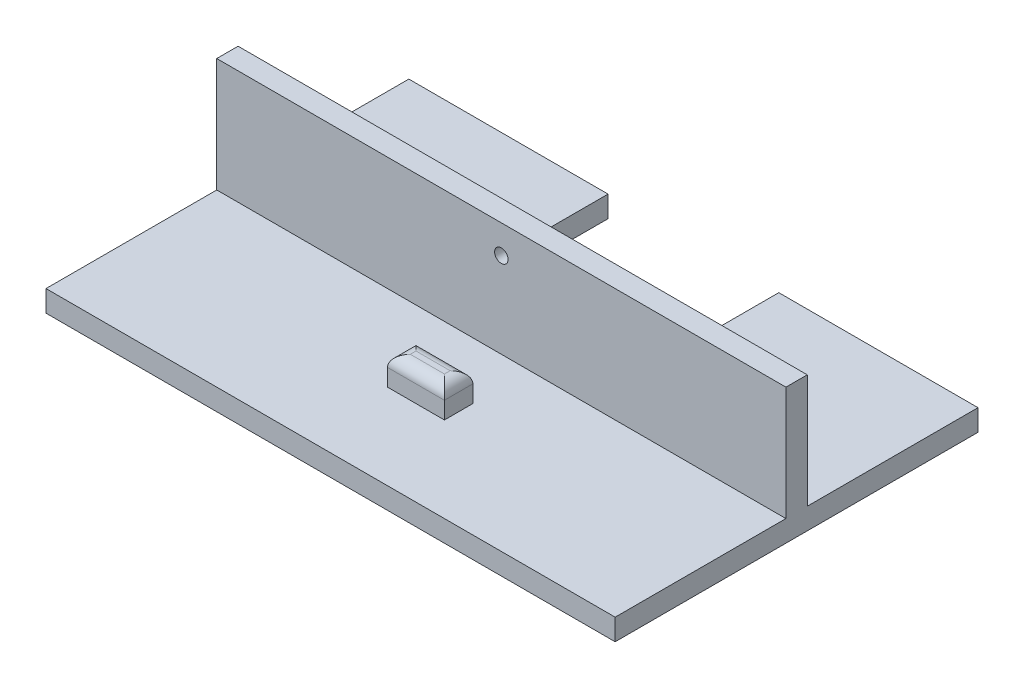
ISO-10303-21;
HEADER;
FILE_DESCRIPTION(('STEP AP214'),'2;1');
FILE_NAME('part.step','',(''),(''),'','','');
FILE_SCHEMA(('AUTOMOTIVE_DESIGN { 1 0 10303 214 1 1 1 1 }'));
ENDSEC;
DATA;
#1=APPLICATION_CONTEXT('core data for automotive mechanical design processes');
#2=APPLICATION_PROTOCOL_DEFINITION('international standard','automotive_design',2000,#1);
#3=PRODUCT_CONTEXT('',#1,'mechanical');
#4=PRODUCT('Part','Part','',(#3));
#5=PRODUCT_RELATED_PRODUCT_CATEGORY('part','',(#4));
#6=PRODUCT_DEFINITION_FORMATION('','',#4);
#7=PRODUCT_DEFINITION_CONTEXT('part definition',#1,'design');
#8=PRODUCT_DEFINITION('design','',#6,#7);
#9=PRODUCT_DEFINITION_SHAPE('','',#8);
#10=(LENGTH_UNIT() NAMED_UNIT(*) SI_UNIT(.MILLI.,.METRE.));
#11=(NAMED_UNIT(*) PLANE_ANGLE_UNIT() SI_UNIT($,.RADIAN.));
#12=(NAMED_UNIT(*) SI_UNIT($,.STERADIAN.) SOLID_ANGLE_UNIT());
#13=UNCERTAINTY_MEASURE_WITH_UNIT(LENGTH_MEASURE(1.E-05),#10,'distance_accuracy_value','');
#14=(GEOMETRIC_REPRESENTATION_CONTEXT(3) GLOBAL_UNCERTAINTY_ASSIGNED_CONTEXT((#13)) GLOBAL_UNIT_ASSIGNED_CONTEXT((#10,
#11,#12)) REPRESENTATION_CONTEXT('',''));
#15=CARTESIAN_POINT('',(0.,0.,0.));
#16=DIRECTION('',(0.,0.,1.));
#17=DIRECTION('',(1.,0.,0.));
#18=AXIS2_PLACEMENT_3D('',#15,#16,#17);
#19=CARTESIAN_POINT('',(127.,0.,-38.1));
#20=DIRECTION('',(0.,0.,1.));
#21=DIRECTION('',(1.,0.,0.));
#22=AXIS2_PLACEMENT_3D('',#19,#20,#21);
#23=PLANE('',#22);
#24=DIRECTION('',(-1.,0.,0.));
#25=VECTOR('',#24,1.);
#26=CARTESIAN_POINT('',(127.,4.7625,-38.1));
#27=LINE('',#26,#25);
#28=CARTESIAN_POINT('',(44.45,4.7625,-38.1));
#29=VERTEX_POINT('',#28);
#30=CARTESIAN_POINT('',(0.,4.7625,-38.1));
#31=VERTEX_POINT('',#30);
#32=EDGE_CURVE('E313',#29,#31,#27,.T.);
#33=ORIENTED_EDGE('',*,*,#32,.F.);
#34=DIRECTION('',(0.,1.,0.));
#35=VECTOR('',#34,1.);
#36=CARTESIAN_POINT('',(44.45,0.,-38.1));
#37=LINE('',#36,#35);
#38=CARTESIAN_POINT('',(44.45,0.,-38.1));
#39=VERTEX_POINT('',#38);
#40=EDGE_CURVE('E200',#39,#29,#37,.T.);
#41=ORIENTED_EDGE('',*,*,#40,.F.);
#42=DIRECTION('',(-1.,0.,0.));
#43=VECTOR('',#42,1.);
#44=CARTESIAN_POINT('',(127.,0.,-38.1));
#45=LINE('',#44,#43);
#46=CARTESIAN_POINT('',(0.,0.,-38.1));
#47=VERTEX_POINT('',#46);
#48=EDGE_CURVE('E189',#39,#47,#45,.T.);
#49=ORIENTED_EDGE('',*,*,#48,.T.);
#50=DIRECTION('',(0.,1.,0.));
#51=VECTOR('',#50,1.);
#52=CARTESIAN_POINT('',(0.,0.,-38.1));
#53=LINE('',#52,#51);
#54=EDGE_CURVE('E303',#47,#31,#53,.T.);
#55=ORIENTED_EDGE('',*,*,#54,.T.);
#56=EDGE_LOOP('',(#33,#41,#49,#55));
#57=FACE_BOUND('',#56,.T.);
#58=ADVANCED_FACE('F40',(#57),#23,.F.);
#59=CARTESIAN_POINT('',(127.,4.7625,0.));
#60=DIRECTION('',(0.,1.,0.));
#61=DIRECTION('',(0.,0.,1.));
#62=AXIS2_PLACEMENT_3D('',#59,#60,#61);
#63=PLANE('',#62);
#64=DIRECTION('',(0.,0.,1.));
#65=VECTOR('',#64,1.);
#66=CARTESIAN_POINT('',(44.45,4.7625,-38.1));
#67=LINE('',#66,#65);
#68=CARTESIAN_POINT('',(44.45,4.7625,0.));
#69=VERTEX_POINT('',#68);
#70=EDGE_CURVE('E58',#29,#69,#67,.T.);
#71=ORIENTED_EDGE('',*,*,#70,.F.);
#72=ORIENTED_EDGE('',*,*,#32,.T.);
#73=DIRECTION('',(0.,0.,-1.));
#74=VECTOR('',#73,1.);
#75=CARTESIAN_POINT('',(0.,4.7625,0.));
#76=LINE('',#75,#74);
#77=CARTESIAN_POINT('',(0.,4.7625,0.));
#78=VERTEX_POINT('',#77);
#79=EDGE_CURVE('E252',#78,#31,#76,.T.);
#80=ORIENTED_EDGE('',*,*,#79,.F.);
#81=DIRECTION('',(-1.,0.,0.));
#82=VECTOR('',#81,1.);
#83=CARTESIAN_POINT('',(127.,4.7625,0.));
#84=LINE('',#83,#82);
#85=EDGE_CURVE('E279',#69,#78,#84,.T.);
#86=ORIENTED_EDGE('',*,*,#85,.F.);
#87=EDGE_LOOP('',(#71,#72,#80,#86));
#88=FACE_BOUND('',#87,.T.);
#89=ADVANCED_FACE('F408',(#88),#63,.T.);
#90=CARTESIAN_POINT('',(127.,4.7625,0.));
#91=DIRECTION('',(0.,1.,0.));
#92=DIRECTION('',(0.,0.,1.));
#93=AXIS2_PLACEMENT_3D('',#90,#91,#92);
#94=PLANE('',#93);
#95=DIRECTION('',(0.,0.,-1.));
#96=VECTOR('',#95,1.);
#97=CARTESIAN_POINT('',(0.,4.7625,0.));
#98=LINE('',#97,#96);
#99=CARTESIAN_POINT('',(0.,4.7625,42.8625));
#100=VERTEX_POINT('',#99);
#101=CARTESIAN_POINT('',(0.,4.7625,4.7625));
#102=VERTEX_POINT('',#101);
#103=EDGE_CURVE('E291',#100,#102,#98,.T.);
#104=ORIENTED_EDGE('',*,*,#103,.F.);
#105=DIRECTION('',(-1.,0.,0.));
#106=VECTOR('',#105,1.);
#107=CARTESIAN_POINT('',(127.,4.7625,42.8625));
#108=LINE('',#107,#106);
#109=CARTESIAN_POINT('',(127.,4.7625,42.8625));
#110=VERTEX_POINT('',#109);
#111=EDGE_CURVE('E325',#110,#100,#108,.T.);
#112=ORIENTED_EDGE('',*,*,#111,.F.);
#113=DIRECTION('',(0.,0.,-1.));
#114=VECTOR('',#113,1.);
#115=CARTESIAN_POINT('',(127.,4.7625,0.));
#116=LINE('',#115,#114);
#117=CARTESIAN_POINT('',(127.,4.7625,4.7625));
#118=VERTEX_POINT('',#117);
#119=EDGE_CURVE('E260',#110,#118,#116,.T.);
#120=ORIENTED_EDGE('',*,*,#119,.T.);
#121=DIRECTION('',(-1.,0.,0.));
#122=VECTOR('',#121,1.);
#123=CARTESIAN_POINT('',(127.,4.7625,4.7625));
#124=LINE('',#123,#122);
#125=EDGE_CURVE('E328',#118,#102,#124,.T.);
#126=ORIENTED_EDGE('',*,*,#125,.T.);
#127=EDGE_LOOP('',(#104,#112,#120,#126));
#128=FACE_BOUND('',#127,.T.);
#129=DIRECTION('',(1.,0.,0.));
#130=VECTOR('',#129,1.);
#131=CARTESIAN_POINT('',(57.15,4.7625,23.8125));
#132=LINE('',#131,#130);
#133=CARTESIAN_POINT('',(57.15,4.7625,23.8125));
#134=VERTEX_POINT('',#133);
#135=CARTESIAN_POINT('',(69.85,4.7625,23.8125));
#136=VERTEX_POINT('',#135);
#137=EDGE_CURVE('E222',#134,#136,#132,.T.);
#138=ORIENTED_EDGE('',*,*,#137,.F.);
#139=DIRECTION('',(0.,0.,1.));
#140=VECTOR('',#139,1.);
#141=CARTESIAN_POINT('',(57.15,4.7625,23.8125));
#142=LINE('',#141,#140);
#143=CARTESIAN_POINT('',(57.15,4.7625,17.4625));
#144=VERTEX_POINT('',#143);
#145=EDGE_CURVE('E218',#144,#134,#142,.T.);
#146=ORIENTED_EDGE('',*,*,#145,.F.);
#147=DIRECTION('',(-1.,0.,0.));
#148=VECTOR('',#147,1.);
#149=CARTESIAN_POINT('',(57.15,4.7625,17.4625));
#150=LINE('',#149,#148);
#151=CARTESIAN_POINT('',(69.85,4.7625,17.4625));
#152=VERTEX_POINT('',#151);
#153=EDGE_CURVE('E230',#152,#144,#150,.T.);
#154=ORIENTED_EDGE('',*,*,#153,.F.);
#155=DIRECTION('',(0.,0.,-1.));
#156=VECTOR('',#155,1.);
#157=CARTESIAN_POINT('',(69.85,4.7625,23.8125));
#158=LINE('',#157,#156);
#159=EDGE_CURVE('E226',#136,#152,#158,.T.);
#160=ORIENTED_EDGE('',*,*,#159,.F.);
#161=EDGE_LOOP('',(#138,#146,#154,#160));
#162=FACE_BOUND('',#161,.T.);
#163=ADVANCED_FACE('F416',(#128,#162),#94,.T.);
#164=CARTESIAN_POINT('',(127.,0.,0.));
#165=DIRECTION('',(0.,0.,-1.));
#166=DIRECTION('',(0.,1.,0.));
#167=AXIS2_PLACEMENT_3D('',#164,#165,#166);
#168=PLANE('',#167);
#169=CARTESIAN_POINT('',(63.5,23.8125,0.));
#170=DIRECTION('',(0.,0.,-1.));
#171=DIRECTION('',(0.,1.,0.));
#172=AXIS2_PLACEMENT_3D('',#169,#170,#171);
#173=CIRCLE('',#172,1.49999700000001);
#174=CARTESIAN_POINT('',(63.5,25.312497,0.));
#175=VERTEX_POINT('',#174);
#176=EDGE_CURVE('E214',#175,#175,#173,.T.);
#177=ORIENTED_EDGE('',*,*,#176,.F.);
#178=EDGE_LOOP('',(#177));
#179=FACE_BOUND('',#178,.T.);
#180=DIRECTION('',(0.,-1.,0.));
#181=VECTOR('',#180,1.);
#182=CARTESIAN_POINT('',(0.,0.,0.));
#183=LINE('',#182,#181);
#184=CARTESIAN_POINT('',(0.,30.1625,0.));
#185=VERTEX_POINT('',#184);
#186=EDGE_CURVE('E246',#185,#78,#183,.T.);
#187=ORIENTED_EDGE('',*,*,#186,.F.);
#188=DIRECTION('',(-1.,0.,0.));
#189=VECTOR('',#188,1.);
#190=CARTESIAN_POINT('',(127.,30.1625,0.));
#191=LINE('',#190,#189);
#192=CARTESIAN_POINT('',(127.,30.1625,0.));
#193=VERTEX_POINT('',#192);
#194=EDGE_CURVE('E334',#193,#185,#191,.T.);
#195=ORIENTED_EDGE('',*,*,#194,.F.);
#196=DIRECTION('',(0.,-1.,0.));
#197=VECTOR('',#196,1.);
#198=CARTESIAN_POINT('',(127.,0.,0.));
#199=LINE('',#198,#197);
#200=CARTESIAN_POINT('',(127.,4.7625,0.));
#201=VERTEX_POINT('',#200);
#202=EDGE_CURVE('E247',#193,#201,#199,.T.);
#203=ORIENTED_EDGE('',*,*,#202,.T.);
#204=CARTESIAN_POINT('',(82.55,4.7625,0.));
#205=VERTEX_POINT('',#204);
#206=EDGE_CURVE('E310',#201,#205,#84,.T.);
#207=ORIENTED_EDGE('',*,*,#206,.T.);
#208=DIRECTION('',(0.,1.,0.));
#209=VECTOR('',#208,1.);
#210=CARTESIAN_POINT('',(82.55,0.,0.));
#211=LINE('',#210,#209);
#212=CARTESIAN_POINT('',(82.55,0.,0.));
#213=VERTEX_POINT('',#212);
#214=EDGE_CURVE('E173',#213,#205,#211,.T.);
#215=ORIENTED_EDGE('',*,*,#214,.F.);
#216=DIRECTION('',(1.,0.,0.));
#217=VECTOR('',#216,1.);
#218=CARTESIAN_POINT('',(44.45,0.,0.));
#219=LINE('',#218,#217);
#220=CARTESIAN_POINT('',(44.45,0.,0.));
#221=VERTEX_POINT('',#220);
#222=EDGE_CURVE('E177',#221,#213,#219,.T.);
#223=ORIENTED_EDGE('',*,*,#222,.F.);
#224=DIRECTION('',(0.,1.,0.));
#225=VECTOR('',#224,1.);
#226=CARTESIAN_POINT('',(44.45,0.,0.));
#227=LINE('',#226,#225);
#228=EDGE_CURVE('E164',#221,#69,#227,.T.);
#229=ORIENTED_EDGE('',*,*,#228,.T.);
#230=ORIENTED_EDGE('',*,*,#85,.T.);
#231=EDGE_LOOP('',(#187,#195,#203,#207,#215,#223,#229,#230));
#232=FACE_BOUND('',#231,.T.);
#233=ADVANCED_FACE('F179',(#179,#232),#168,.T.);
#234=CARTESIAN_POINT('',(127.,30.1625,0.));
#235=DIRECTION('',(0.,1.,0.));
#236=DIRECTION('',(0.,0.,1.));
#237=AXIS2_PLACEMENT_3D('',#234,#235,#236);
#238=PLANE('',#237);
#239=DIRECTION('',(0.,0.,-1.));
#240=VECTOR('',#239,1.);
#241=CARTESIAN_POINT('',(0.,30.1625,0.));
#242=LINE('',#241,#240);
#243=CARTESIAN_POINT('',(0.,30.1625,4.7625));
#244=VERTEX_POINT('',#243);
#245=EDGE_CURVE('E283',#244,#185,#242,.T.);
#246=ORIENTED_EDGE('',*,*,#245,.F.);
#247=DIRECTION('',(-1.,0.,0.));
#248=VECTOR('',#247,1.);
#249=CARTESIAN_POINT('',(127.,30.1625,4.7625));
#250=LINE('',#249,#248);
#251=CARTESIAN_POINT('',(127.,30.1625,4.7625));
#252=VERTEX_POINT('',#251);
#253=EDGE_CURVE('E331',#252,#244,#250,.T.);
#254=ORIENTED_EDGE('',*,*,#253,.F.);
#255=DIRECTION('',(0.,0.,-1.));
#256=VECTOR('',#255,1.);
#257=CARTESIAN_POINT('',(127.,30.1625,0.));
#258=LINE('',#257,#256);
#259=EDGE_CURVE('E251',#252,#193,#258,.T.);
#260=ORIENTED_EDGE('',*,*,#259,.T.);
#261=ORIENTED_EDGE('',*,*,#194,.T.);
#262=EDGE_LOOP('',(#246,#254,#260,#261));
#263=FACE_BOUND('',#262,.T.);
#264=ADVANCED_FACE('F457',(#263),#238,.T.);
#265=CARTESIAN_POINT('',(127.,0.,4.7625));
#266=DIRECTION('',(0.,0.,1.));
#267=DIRECTION('',(0.,-1.,0.));
#268=AXIS2_PLACEMENT_3D('',#265,#266,#267);
#269=PLANE('',#268);
#270=CARTESIAN_POINT('',(63.5,23.8125,4.7625));
#271=DIRECTION('',(0.,0.,1.));
#272=DIRECTION('',(1.,0.,0.));
#273=AXIS2_PLACEMENT_3D('',#270,#271,#272);
#274=CIRCLE('',#273,1.49999700000001);
#275=CARTESIAN_POINT('',(64.999997,23.8125,4.7625));
#276=VERTEX_POINT('',#275);
#277=EDGE_CURVE('E210',#276,#276,#274,.T.);
#278=ORIENTED_EDGE('',*,*,#277,.F.);
#279=EDGE_LOOP('',(#278));
#280=FACE_BOUND('',#279,.T.);
#281=DIRECTION('',(0.,1.,0.));
#282=VECTOR('',#281,1.);
#283=CARTESIAN_POINT('',(0.,0.,4.7625));
#284=LINE('',#283,#282);
#285=EDGE_CURVE('E287',#102,#244,#284,.T.);
#286=ORIENTED_EDGE('',*,*,#285,.F.);
#287=ORIENTED_EDGE('',*,*,#125,.F.);
#288=DIRECTION('',(0.,1.,0.));
#289=VECTOR('',#288,1.);
#290=CARTESIAN_POINT('',(127.,0.,4.7625));
#291=LINE('',#290,#289);
#292=EDGE_CURVE('E256',#118,#252,#291,.T.);
#293=ORIENTED_EDGE('',*,*,#292,.T.);
#294=ORIENTED_EDGE('',*,*,#253,.T.);
#295=EDGE_LOOP('',(#286,#287,#293,#294));
#296=FACE_BOUND('',#295,.T.);
#297=ADVANCED_FACE('F459',(#280,#296),#269,.T.);
#298=CARTESIAN_POINT('',(127.,0.,42.8625));
#299=DIRECTION('',(0.,0.,1.));
#300=DIRECTION('',(1.,0.,0.));
#301=AXIS2_PLACEMENT_3D('',#298,#299,#300);
#302=PLANE('',#301);
#303=DIRECTION('',(0.,1.,0.));
#304=VECTOR('',#303,1.);
#305=CARTESIAN_POINT('',(0.,0.,42.8625));
#306=LINE('',#305,#304);
#307=CARTESIAN_POINT('',(0.,0.,42.8625));
#308=VERTEX_POINT('',#307);
#309=EDGE_CURVE('E295',#308,#100,#306,.T.);
#310=ORIENTED_EDGE('',*,*,#309,.F.);
#311=DIRECTION('',(-1.,0.,0.));
#312=VECTOR('',#311,1.);
#313=CARTESIAN_POINT('',(127.,0.,42.8625));
#314=LINE('',#313,#312);
#315=CARTESIAN_POINT('',(127.,0.,42.8625));
#316=VERTEX_POINT('',#315);
#317=EDGE_CURVE('E322',#316,#308,#314,.T.);
#318=ORIENTED_EDGE('',*,*,#317,.F.);
#319=DIRECTION('',(0.,1.,0.));
#320=VECTOR('',#319,1.);
#321=CARTESIAN_POINT('',(127.,0.,42.8625));
#322=LINE('',#321,#320);
#323=EDGE_CURVE('E264',#316,#110,#322,.T.);
#324=ORIENTED_EDGE('',*,*,#323,.T.);
#325=ORIENTED_EDGE('',*,*,#111,.T.);
#326=EDGE_LOOP('',(#310,#318,#324,#325));
#327=FACE_BOUND('',#326,.T.);
#328=ADVANCED_FACE('F430',(#327),#302,.T.);
#329=CARTESIAN_POINT('',(127.,0.,0.));
#330=DIRECTION('',(0.,-1.,0.));
#331=DIRECTION('',(0.,0.,-1.));
#332=AXIS2_PLACEMENT_3D('',#329,#330,#331);
#333=PLANE('',#332);
#334=DIRECTION('',(0.,0.,1.));
#335=VECTOR('',#334,1.);
#336=CARTESIAN_POINT('',(44.45,0.,-38.1));
#337=LINE('',#336,#335);
#338=EDGE_CURVE('E168',#39,#221,#337,.T.);
#339=ORIENTED_EDGE('',*,*,#338,.T.);
#340=ORIENTED_EDGE('',*,*,#222,.T.);
#341=DIRECTION('',(0.,0.,-1.));
#342=VECTOR('',#341,1.);
#343=CARTESIAN_POINT('',(82.55,0.,-38.1));
#344=LINE('',#343,#342);
#345=CARTESIAN_POINT('',(82.55,0.,-38.1));
#346=VERTEX_POINT('',#345);
#347=EDGE_CURVE('E174',#213,#346,#344,.T.);
#348=ORIENTED_EDGE('',*,*,#347,.T.);
#349=CARTESIAN_POINT('',(127.,0.,-38.1));
#350=VERTEX_POINT('',#349);
#351=EDGE_CURVE('E318',#350,#346,#45,.T.);
#352=ORIENTED_EDGE('',*,*,#351,.F.);
#353=DIRECTION('',(0.,0.,1.));
#354=VECTOR('',#353,1.);
#355=CARTESIAN_POINT('',(127.,0.,0.));
#356=LINE('',#355,#354);
#357=EDGE_CURVE('E268',#350,#316,#356,.T.);
#358=ORIENTED_EDGE('',*,*,#357,.T.);
#359=ORIENTED_EDGE('',*,*,#317,.T.);
#360=DIRECTION('',(0.,0.,1.));
#361=VECTOR('',#360,1.);
#362=CARTESIAN_POINT('',(0.,0.,0.));
#363=LINE('',#362,#361);
#364=EDGE_CURVE('E299',#47,#308,#363,.T.);
#365=ORIENTED_EDGE('',*,*,#364,.F.);
#366=ORIENTED_EDGE('',*,*,#48,.F.);
#367=EDGE_LOOP('',(#339,#340,#348,#352,#358,#359,#365,#366));
#368=FACE_BOUND('',#367,.T.);
#369=ADVANCED_FACE('F187',(#368),#333,.T.);
#370=ORIENTED_EDGE('',*,*,#351,.T.);
#371=DIRECTION('',(0.,1.,0.));
#372=VECTOR('',#371,1.);
#373=CARTESIAN_POINT('',(82.55,0.,-38.1));
#374=LINE('',#373,#372);
#375=CARTESIAN_POINT('',(82.55,4.7625,-38.1));
#376=VERTEX_POINT('',#375);
#377=EDGE_CURVE('E204',#346,#376,#374,.T.);
#378=ORIENTED_EDGE('',*,*,#377,.T.);
#379=CARTESIAN_POINT('',(127.,4.7625,-38.1));
#380=VERTEX_POINT('',#379);
#381=EDGE_CURVE('E314',#380,#376,#27,.T.);
#382=ORIENTED_EDGE('',*,*,#381,.F.);
#383=DIRECTION('',(0.,1.,0.));
#384=VECTOR('',#383,1.);
#385=CARTESIAN_POINT('',(127.,0.,-38.1));
#386=LINE('',#385,#384);
#387=EDGE_CURVE('E272',#350,#380,#386,.T.);
#388=ORIENTED_EDGE('',*,*,#387,.F.);
#389=EDGE_LOOP('',(#370,#378,#382,#388));
#390=FACE_BOUND('',#389,.T.);
#391=ADVANCED_FACE('F411',(#390),#23,.F.);
#392=DIRECTION('',(0.,0.,-1.));
#393=VECTOR('',#392,1.);
#394=CARTESIAN_POINT('',(82.55,4.7625,-38.1));
#395=LINE('',#394,#393);
#396=EDGE_CURVE('E191',#205,#376,#395,.T.);
#397=ORIENTED_EDGE('',*,*,#396,.F.);
#398=ORIENTED_EDGE('',*,*,#206,.F.);
#399=DIRECTION('',(0.,0.,-1.));
#400=VECTOR('',#399,1.);
#401=CARTESIAN_POINT('',(127.,4.7625,0.));
#402=LINE('',#401,#400);
#403=EDGE_CURVE('E275',#201,#380,#402,.T.);
#404=ORIENTED_EDGE('',*,*,#403,.T.);
#405=ORIENTED_EDGE('',*,*,#381,.T.);
#406=EDGE_LOOP('',(#397,#398,#404,#405));
#407=FACE_BOUND('',#406,.T.);
#408=ADVANCED_FACE('F419',(#407),#63,.T.);
#409=CARTESIAN_POINT('',(127.,0.,0.));
#410=DIRECTION('',(1.,0.,0.));
#411=DIRECTION('',(0.,0.,-1.));
#412=AXIS2_PLACEMENT_3D('',#409,#410,#411);
#413=PLANE('',#412);
#414=ORIENTED_EDGE('',*,*,#202,.F.);
#415=ORIENTED_EDGE('',*,*,#259,.F.);
#416=ORIENTED_EDGE('',*,*,#292,.F.);
#417=ORIENTED_EDGE('',*,*,#119,.F.);
#418=ORIENTED_EDGE('',*,*,#323,.F.);
#419=ORIENTED_EDGE('',*,*,#357,.F.);
#420=ORIENTED_EDGE('',*,*,#387,.T.);
#421=ORIENTED_EDGE('',*,*,#403,.F.);
#422=EDGE_LOOP('',(#414,#415,#416,#417,#418,#419,#420,#421));
#423=FACE_BOUND('',#422,.T.);
#424=ADVANCED_FACE('F428',(#423),#413,.T.);
#425=CARTESIAN_POINT('',(0.,0.,0.));
#426=DIRECTION('',(1.,0.,0.));
#427=DIRECTION('',(0.,0.,-1.));
#428=AXIS2_PLACEMENT_3D('',#425,#426,#427);
#429=PLANE('',#428);
#430=ORIENTED_EDGE('',*,*,#186,.T.);
#431=ORIENTED_EDGE('',*,*,#79,.T.);
#432=ORIENTED_EDGE('',*,*,#54,.F.);
#433=ORIENTED_EDGE('',*,*,#364,.T.);
#434=ORIENTED_EDGE('',*,*,#309,.T.);
#435=ORIENTED_EDGE('',*,*,#103,.T.);
#436=ORIENTED_EDGE('',*,*,#285,.T.);
#437=ORIENTED_EDGE('',*,*,#245,.T.);
#438=EDGE_LOOP('',(#430,#431,#432,#433,#434,#435,#436,#437));
#439=FACE_BOUND('',#438,.T.);
#440=ADVANCED_FACE('F449',(#439),#429,.F.);
#441=CARTESIAN_POINT('',(57.15,11.1125,23.8125));
#442=DIRECTION('',(1.,0.,0.));
#443=DIRECTION('',(0.,0.,-1.));
#444=AXIS2_PLACEMENT_3D('',#441,#442,#443);
#445=PLANE('',#444);
#446=DIRECTION('',(0.,-1.,0.));
#447=VECTOR('',#446,1.);
#448=CARTESIAN_POINT('',(57.15,11.1125,23.8125));
#449=LINE('',#448,#447);
#450=CARTESIAN_POINT('',(57.15,8.5725,23.8125));
#451=VERTEX_POINT('',#450);
#452=EDGE_CURVE('E243',#451,#134,#449,.T.);
#453=ORIENTED_EDGE('',*,*,#452,.F.);
#454=DIRECTION('',(0.,0.,1.));
#455=VECTOR('',#454,1.);
#456=CARTESIAN_POINT('',(57.15,8.5725,23.8125));
#457=LINE('',#456,#455);
#458=CARTESIAN_POINT('',(57.15,8.5725,17.4625));
#459=VERTEX_POINT('',#458);
#460=EDGE_CURVE('E11',#451,#459,#457,.F.);
#461=ORIENTED_EDGE('',*,*,#460,.T.);
#462=DIRECTION('',(0.,-1.,0.));
#463=VECTOR('',#462,1.);
#464=CARTESIAN_POINT('',(57.15,11.1125,17.4625));
#465=LINE('',#464,#463);
#466=EDGE_CURVE('E234',#459,#144,#465,.T.);
#467=ORIENTED_EDGE('',*,*,#466,.T.);
#468=ORIENTED_EDGE('',*,*,#145,.T.);
#469=EDGE_LOOP('',(#453,#461,#467,#468));
#470=FACE_BOUND('',#469,.T.);
#471=ADVANCED_FACE('F384',(#470),#445,.F.);
#472=CARTESIAN_POINT('',(57.15,11.1125,23.8125));
#473=DIRECTION('',(0.,0.,-1.));
#474=DIRECTION('',(0.,1.,0.));
#475=AXIS2_PLACEMENT_3D('',#472,#473,#474);
#476=PLANE('',#475);
#477=DIRECTION('',(0.,-1.,0.));
#478=VECTOR('',#477,1.);
#479=CARTESIAN_POINT('',(69.85,11.1125,23.8125));
#480=LINE('',#479,#478);
#481=CARTESIAN_POINT('',(69.85,8.5725,23.8125));
#482=VERTEX_POINT('',#481);
#483=EDGE_CURVE('E240',#482,#136,#480,.T.);
#484=ORIENTED_EDGE('',*,*,#483,.F.);
#485=DIRECTION('',(1.,0.,0.));
#486=VECTOR('',#485,1.);
#487=CARTESIAN_POINT('',(57.15,8.5725,23.8125));
#488=LINE('',#487,#486);
#489=EDGE_CURVE('E50',#482,#451,#488,.F.);
#490=ORIENTED_EDGE('',*,*,#489,.T.);
#491=ORIENTED_EDGE('',*,*,#452,.T.);
#492=ORIENTED_EDGE('',*,*,#137,.T.);
#493=EDGE_LOOP('',(#484,#490,#491,#492));
#494=FACE_BOUND('',#493,.T.);
#495=ADVANCED_FACE('F466',(#494),#476,.F.);
#496=CARTESIAN_POINT('',(69.85,11.1125,23.8125));
#497=DIRECTION('',(-1.,0.,0.));
#498=DIRECTION('',(0.,0.,1.));
#499=AXIS2_PLACEMENT_3D('',#496,#497,#498);
#500=PLANE('',#499);
#501=DIRECTION('',(0.,-1.,0.));
#502=VECTOR('',#501,1.);
#503=CARTESIAN_POINT('',(69.85,11.1125,17.4625));
#504=LINE('',#503,#502);
#505=CARTESIAN_POINT('',(69.85,8.5725,17.4625));
#506=VERTEX_POINT('',#505);
#507=EDGE_CURVE('E237',#506,#152,#504,.T.);
#508=ORIENTED_EDGE('',*,*,#507,.F.);
#509=DIRECTION('',(0.,0.,-1.));
#510=VECTOR('',#509,1.);
#511=CARTESIAN_POINT('',(69.85,8.5725,23.8125));
#512=LINE('',#511,#510);
#513=EDGE_CURVE('E354',#506,#482,#512,.F.);
#514=ORIENTED_EDGE('',*,*,#513,.T.);
#515=ORIENTED_EDGE('',*,*,#483,.T.);
#516=ORIENTED_EDGE('',*,*,#159,.T.);
#517=EDGE_LOOP('',(#508,#514,#515,#516));
#518=FACE_BOUND('',#517,.T.);
#519=ADVANCED_FACE('F405',(#518),#500,.F.);
#520=CARTESIAN_POINT('',(57.15,11.1125,17.4625));
#521=DIRECTION('',(0.,0.,1.));
#522=DIRECTION('',(0.,-1.,0.));
#523=AXIS2_PLACEMENT_3D('',#520,#521,#522);
#524=PLANE('',#523);
#525=ORIENTED_EDGE('',*,*,#466,.F.);
#526=DIRECTION('',(-1.,0.,0.));
#527=VECTOR('',#526,1.);
#528=CARTESIAN_POINT('',(57.15,8.5725,17.4625));
#529=LINE('',#528,#527);
#530=EDGE_CURVE('E350',#459,#506,#529,.F.);
#531=ORIENTED_EDGE('',*,*,#530,.T.);
#532=ORIENTED_EDGE('',*,*,#507,.T.);
#533=ORIENTED_EDGE('',*,*,#153,.T.);
#534=EDGE_LOOP('',(#525,#531,#532,#533));
#535=FACE_BOUND('',#534,.T.);
#536=ADVANCED_FACE('F387',(#535),#524,.F.);
#537=CARTESIAN_POINT('',(0.,11.1125,0.));
#538=DIRECTION('',(0.,-1.,0.));
#539=DIRECTION('',(0.,0.,-1.));
#540=AXIS2_PLACEMENT_3D('',#537,#538,#539);
#541=PLANE('',#540);
#542=DIRECTION('',(0.,0.,-1.));
#543=VECTOR('',#542,1.);
#544=CARTESIAN_POINT('',(67.31,11.1125,0.));
#545=LINE('',#544,#543);
#546=CARTESIAN_POINT('',(67.31,11.1125,21.2725));
#547=VERTEX_POINT('',#546);
#548=CARTESIAN_POINT('',(67.31,11.1125,20.0025));
#549=VERTEX_POINT('',#548);
#550=EDGE_CURVE('E343',#547,#549,#545,.T.);
#551=ORIENTED_EDGE('',*,*,#550,.T.);
#552=DIRECTION('',(-1.,0.,0.));
#553=VECTOR('',#552,1.);
#554=CARTESIAN_POINT('',(0.,11.1125,20.0025));
#555=LINE('',#554,#553);
#556=CARTESIAN_POINT('',(59.69,11.1125,20.0025));
#557=VERTEX_POINT('',#556);
#558=EDGE_CURVE('E346',#549,#557,#555,.T.);
#559=ORIENTED_EDGE('',*,*,#558,.T.);
#560=DIRECTION('',(0.,0.,1.));
#561=VECTOR('',#560,1.);
#562=CARTESIAN_POINT('',(59.69,11.1125,0.));
#563=LINE('',#562,#561);
#564=CARTESIAN_POINT('',(59.69,11.1125,21.2725));
#565=VERTEX_POINT('',#564);
#566=EDGE_CURVE('E337',#557,#565,#563,.T.);
#567=ORIENTED_EDGE('',*,*,#566,.T.);
#568=DIRECTION('',(1.,0.,0.));
#569=VECTOR('',#568,1.);
#570=CARTESIAN_POINT('',(0.,11.1125,21.2725));
#571=LINE('',#570,#569);
#572=EDGE_CURVE('E340',#565,#547,#571,.T.);
#573=ORIENTED_EDGE('',*,*,#572,.T.);
#574=EDGE_LOOP('',(#551,#559,#567,#573));
#575=FACE_BOUND('',#574,.T.);
#576=ADVANCED_FACE('F395',(#575),#541,.F.);
#577=CARTESIAN_POINT('',(63.5,23.8125,-38.1));
#578=DIRECTION('',(0.,0.,1.));
#579=DIRECTION('',(1.,0.,0.));
#580=AXIS2_PLACEMENT_3D('',#577,#578,#579);
#581=CYLINDRICAL_SURFACE('',#580,1.49999700000001);
#582=ORIENTED_EDGE('',*,*,#176,.T.);
#583=EDGE_LOOP('',(#582));
#584=FACE_BOUND('',#583,.T.);
#585=ORIENTED_EDGE('',*,*,#277,.T.);
#586=EDGE_LOOP('',(#585));
#587=FACE_BOUND('',#586,.T.);
#588=ADVANCED_FACE('F397',(#584,#587),#581,.F.);
#589=CARTESIAN_POINT('',(0.,8.5725,21.2725));
#590=DIRECTION('',(1.,0.,0.));
#591=DIRECTION('',(0.,0.,-1.));
#592=AXIS2_PLACEMENT_3D('',#589,#590,#591);
#593=CYLINDRICAL_SURFACE('',#592,2.54);
#594=CARTESIAN_POINT('',(59.69,8.5725,21.2725));
#595=DIRECTION('',(0.707106781186547,0.,0.707106781186547));
#596=DIRECTION('',(-0.707106781186547,0.,0.707106781186547));
#597=AXIS2_PLACEMENT_3D('',#594,#595,#596);
#598=ELLIPSE('',#597,3.59210244842766,2.54);
#599=EDGE_CURVE('E363',#451,#565,#598,.F.);
#600=ORIENTED_EDGE('',*,*,#599,.F.);
#601=ORIENTED_EDGE('',*,*,#489,.F.);
#602=CARTESIAN_POINT('',(67.31,8.5725,21.2725));
#603=DIRECTION('',(0.707106781186547,0.,-0.707106781186547));
#604=DIRECTION('',(0.707106781186547,0.,0.707106781186547));
#605=AXIS2_PLACEMENT_3D('',#602,#603,#604);
#606=ELLIPSE('',#605,3.59210244842766,2.54);
#607=EDGE_CURVE('E44',#547,#482,#606,.T.);
#608=ORIENTED_EDGE('',*,*,#607,.F.);
#609=ORIENTED_EDGE('',*,*,#572,.F.);
#610=EDGE_LOOP('',(#600,#601,#608,#609));
#611=FACE_BOUND('',#610,.T.);
#612=ADVANCED_FACE('F42',(#611),#593,.T.);
#613=CARTESIAN_POINT('',(67.31,8.5725,0.));
#614=DIRECTION('',(0.,0.,-1.));
#615=DIRECTION('',(-1.,0.,0.));
#616=AXIS2_PLACEMENT_3D('',#613,#614,#615);
#617=CYLINDRICAL_SURFACE('',#616,2.54);
#618=ORIENTED_EDGE('',*,*,#607,.T.);
#619=ORIENTED_EDGE('',*,*,#513,.F.);
#620=CARTESIAN_POINT('',(67.31,8.5725,20.0025));
#621=DIRECTION('',(-0.707106781186547,0.,-0.707106781186547));
#622=DIRECTION('',(0.707106781186547,0.,-0.707106781186547));
#623=AXIS2_PLACEMENT_3D('',#620,#621,#622);
#624=ELLIPSE('',#623,3.59210244842766,2.54);
#625=EDGE_CURVE('E361',#549,#506,#624,.T.);
#626=ORIENTED_EDGE('',*,*,#625,.F.);
#627=ORIENTED_EDGE('',*,*,#550,.F.);
#628=EDGE_LOOP('',(#618,#619,#626,#627));
#629=FACE_BOUND('',#628,.T.);
#630=ADVANCED_FACE('F376',(#629),#617,.T.);
#631=CARTESIAN_POINT('',(59.69,8.5725,0.));
#632=DIRECTION('',(0.,0.,1.));
#633=DIRECTION('',(1.,0.,0.));
#634=AXIS2_PLACEMENT_3D('',#631,#632,#633);
#635=CYLINDRICAL_SURFACE('',#634,2.54);
#636=ORIENTED_EDGE('',*,*,#599,.T.);
#637=ORIENTED_EDGE('',*,*,#566,.F.);
#638=CARTESIAN_POINT('',(59.69,8.5725,20.0025));
#639=DIRECTION('',(-0.707106781186547,0.,0.707106781186547));
#640=DIRECTION('',(0.707106781186547,0.,0.707106781186547));
#641=AXIS2_PLACEMENT_3D('',#638,#639,#640);
#642=ELLIPSE('',#641,3.59210244842766,2.54);
#643=EDGE_CURVE('E203',#459,#557,#642,.F.);
#644=ORIENTED_EDGE('',*,*,#643,.F.);
#645=ORIENTED_EDGE('',*,*,#460,.F.);
#646=EDGE_LOOP('',(#636,#637,#644,#645));
#647=FACE_BOUND('',#646,.T.);
#648=ADVANCED_FACE('F381',(#647),#635,.T.);
#649=CARTESIAN_POINT('',(0.,8.5725,20.0025));
#650=DIRECTION('',(-1.,0.,0.));
#651=DIRECTION('',(0.,0.,1.));
#652=AXIS2_PLACEMENT_3D('',#649,#650,#651);
#653=CYLINDRICAL_SURFACE('',#652,2.54);
#654=ORIENTED_EDGE('',*,*,#625,.T.);
#655=ORIENTED_EDGE('',*,*,#530,.F.);
#656=ORIENTED_EDGE('',*,*,#643,.T.);
#657=ORIENTED_EDGE('',*,*,#558,.F.);
#658=EDGE_LOOP('',(#654,#655,#656,#657));
#659=FACE_BOUND('',#658,.T.);
#660=ADVANCED_FACE('F392',(#659),#653,.T.);
#661=CARTESIAN_POINT('',(44.45,0.,-38.1));
#662=DIRECTION('',(-1.,0.,0.));
#663=DIRECTION('',(0.,0.,1.));
#664=AXIS2_PLACEMENT_3D('',#661,#662,#663);
#665=PLANE('',#664);
#666=ORIENTED_EDGE('',*,*,#70,.T.);
#667=ORIENTED_EDGE('',*,*,#228,.F.);
#668=ORIENTED_EDGE('',*,*,#338,.F.);
#669=ORIENTED_EDGE('',*,*,#40,.T.);
#670=EDGE_LOOP('',(#666,#667,#668,#669));
#671=FACE_BOUND('',#670,.T.);
#672=ADVANCED_FACE('F166',(#671),#665,.F.);
#673=CARTESIAN_POINT('',(82.55,0.,-38.1));
#674=DIRECTION('',(1.,0.,0.));
#675=DIRECTION('',(0.,0.,-1.));
#676=AXIS2_PLACEMENT_3D('',#673,#674,#675);
#677=PLANE('',#676);
#678=ORIENTED_EDGE('',*,*,#396,.T.);
#679=ORIENTED_EDGE('',*,*,#377,.F.);
#680=ORIENTED_EDGE('',*,*,#347,.F.);
#681=ORIENTED_EDGE('',*,*,#214,.T.);
#682=EDGE_LOOP('',(#678,#679,#680,#681));
#683=FACE_BOUND('',#682,.T.);
#684=ADVANCED_FACE('F435',(#683),#677,.F.);
#685=CLOSED_SHELL('',(#58,#89,#163,#233,#264,#297,#328,#369,#391,#408,#424,#440,#471,#495,#519,
#536,#576,#588,#612,#630,#648,#660,#672,#684));
#686=MANIFOLD_SOLID_BREP('B2',#685);
#687=ADVANCED_BREP_SHAPE_REPRESENTATION('',(#18,#686),#14);
#688=SHAPE_DEFINITION_REPRESENTATION(#9,#687);
ENDSEC;
END-ISO-10303-21;
